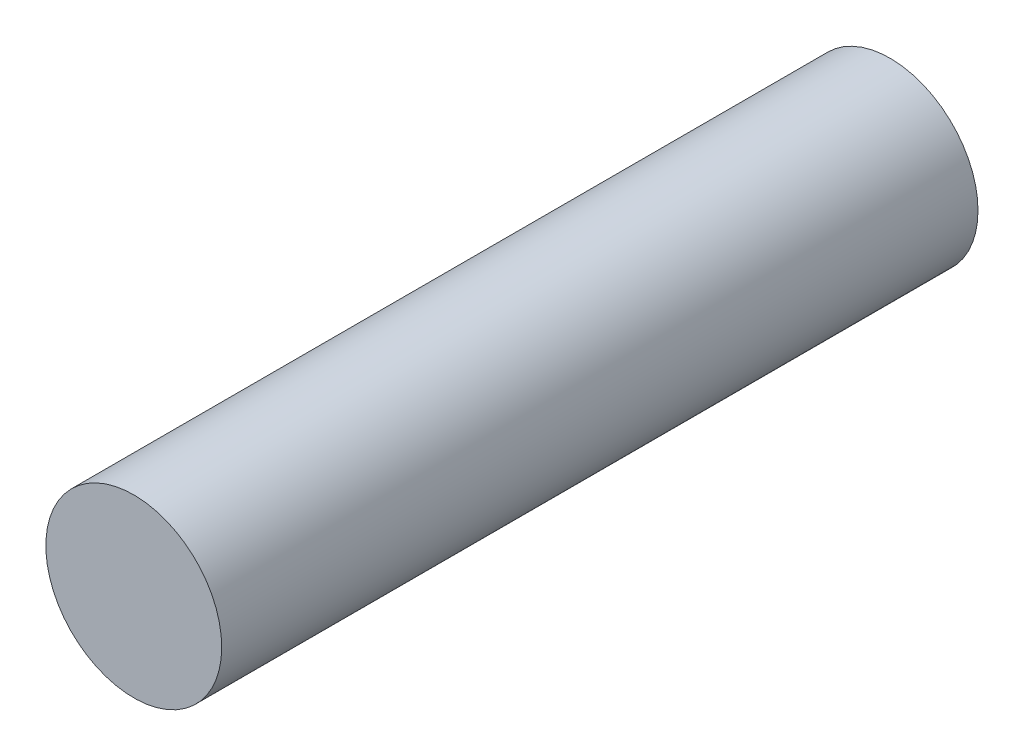
ISO-10303-21;
HEADER;
FILE_DESCRIPTION(('STEP AP214'),'2;1');
FILE_NAME('part.step','',(''),(''),'','','');
FILE_SCHEMA(('AUTOMOTIVE_DESIGN { 1 0 10303 214 1 1 1 1 }'));
ENDSEC;
DATA;
#1=APPLICATION_CONTEXT('core data for automotive mechanical design processes');
#2=APPLICATION_PROTOCOL_DEFINITION('international standard','automotive_design',2000,#1);
#3=PRODUCT_CONTEXT('',#1,'mechanical');
#4=PRODUCT('Part','Part','',(#3));
#5=PRODUCT_RELATED_PRODUCT_CATEGORY('part','',(#4));
#6=PRODUCT_DEFINITION_FORMATION('','',#4);
#7=PRODUCT_DEFINITION_CONTEXT('part definition',#1,'design');
#8=PRODUCT_DEFINITION('design','',#6,#7);
#9=PRODUCT_DEFINITION_SHAPE('','',#8);
#10=(LENGTH_UNIT() NAMED_UNIT(*) SI_UNIT(.MILLI.,.METRE.));
#11=(NAMED_UNIT(*) PLANE_ANGLE_UNIT() SI_UNIT($,.RADIAN.));
#12=(NAMED_UNIT(*) SI_UNIT($,.STERADIAN.) SOLID_ANGLE_UNIT());
#13=UNCERTAINTY_MEASURE_WITH_UNIT(LENGTH_MEASURE(1.E-05),#10,'distance_accuracy_value','');
#14=(GEOMETRIC_REPRESENTATION_CONTEXT(3) GLOBAL_UNCERTAINTY_ASSIGNED_CONTEXT((#13)) GLOBAL_UNIT_ASSIGNED_CONTEXT((#10,
#11,#12)) REPRESENTATION_CONTEXT('',''));
#15=CARTESIAN_POINT('',(0.,0.,0.));
#16=DIRECTION('',(0.,0.,1.));
#17=DIRECTION('',(1.,0.,0.));
#18=AXIS2_PLACEMENT_3D('',#15,#16,#17);
#19=CARTESIAN_POINT('',(0.,0.,43.));
#20=DIRECTION('',(0.,0.,-1.));
#21=DIRECTION('',(-1.,0.,0.));
#22=AXIS2_PLACEMENT_3D('',#19,#20,#21);
#23=CYLINDRICAL_SURFACE('',#22,5.);
#24=CARTESIAN_POINT('',(0.,0.,43.));
#25=DIRECTION('',(0.,0.,1.));
#26=DIRECTION('',(1.,0.,0.));
#27=AXIS2_PLACEMENT_3D('',#24,#25,#26);
#28=CIRCLE('',#27,5.);
#29=CARTESIAN_POINT('',(5.,0.,43.));
#30=VERTEX_POINT('',#29);
#31=EDGE_CURVE('E10',#30,#30,#28,.T.);
#32=ORIENTED_EDGE('',*,*,#31,.F.);
#33=EDGE_LOOP('',(#32));
#34=FACE_BOUND('',#33,.T.);
#35=CARTESIAN_POINT('',(0.,0.,0.));
#36=DIRECTION('',(0.,0.,1.));
#37=DIRECTION('',(1.,0.,0.));
#38=AXIS2_PLACEMENT_3D('',#35,#36,#37);
#39=CIRCLE('',#38,5.);
#40=CARTESIAN_POINT('',(5.,0.,0.));
#41=VERTEX_POINT('',#40);
#42=EDGE_CURVE('E33',#41,#41,#39,.T.);
#43=ORIENTED_EDGE('',*,*,#42,.T.);
#44=EDGE_LOOP('',(#43));
#45=FACE_BOUND('',#44,.T.);
#46=ADVANCED_FACE('F30',(#34,#45),#23,.T.);
#47=CARTESIAN_POINT('',(0.,0.,43.));
#48=DIRECTION('',(0.,0.,1.));
#49=DIRECTION('',(1.,0.,0.));
#50=AXIS2_PLACEMENT_3D('',#47,#48,#49);
#51=PLANE('',#50);
#52=ORIENTED_EDGE('',*,*,#31,.T.);
#53=EDGE_LOOP('',(#52));
#54=FACE_BOUND('',#53,.T.);
#55=ADVANCED_FACE('F45',(#54),#51,.T.);
#56=CARTESIAN_POINT('',(0.,0.,0.));
#57=DIRECTION('',(0.,0.,1.));
#58=DIRECTION('',(1.,0.,0.));
#59=AXIS2_PLACEMENT_3D('',#56,#57,#58);
#60=PLANE('',#59);
#61=ORIENTED_EDGE('',*,*,#42,.F.);
#62=EDGE_LOOP('',(#61));
#63=FACE_BOUND('',#62,.T.);
#64=ADVANCED_FACE('F43',(#63),#60,.F.);
#65=CLOSED_SHELL('',(#46,#55,#64));
#66=MANIFOLD_SOLID_BREP('B2',#65);
#67=ADVANCED_BREP_SHAPE_REPRESENTATION('',(#18,#66),#14);
#68=SHAPE_DEFINITION_REPRESENTATION(#9,#67);
ENDSEC;
END-ISO-10303-21;
